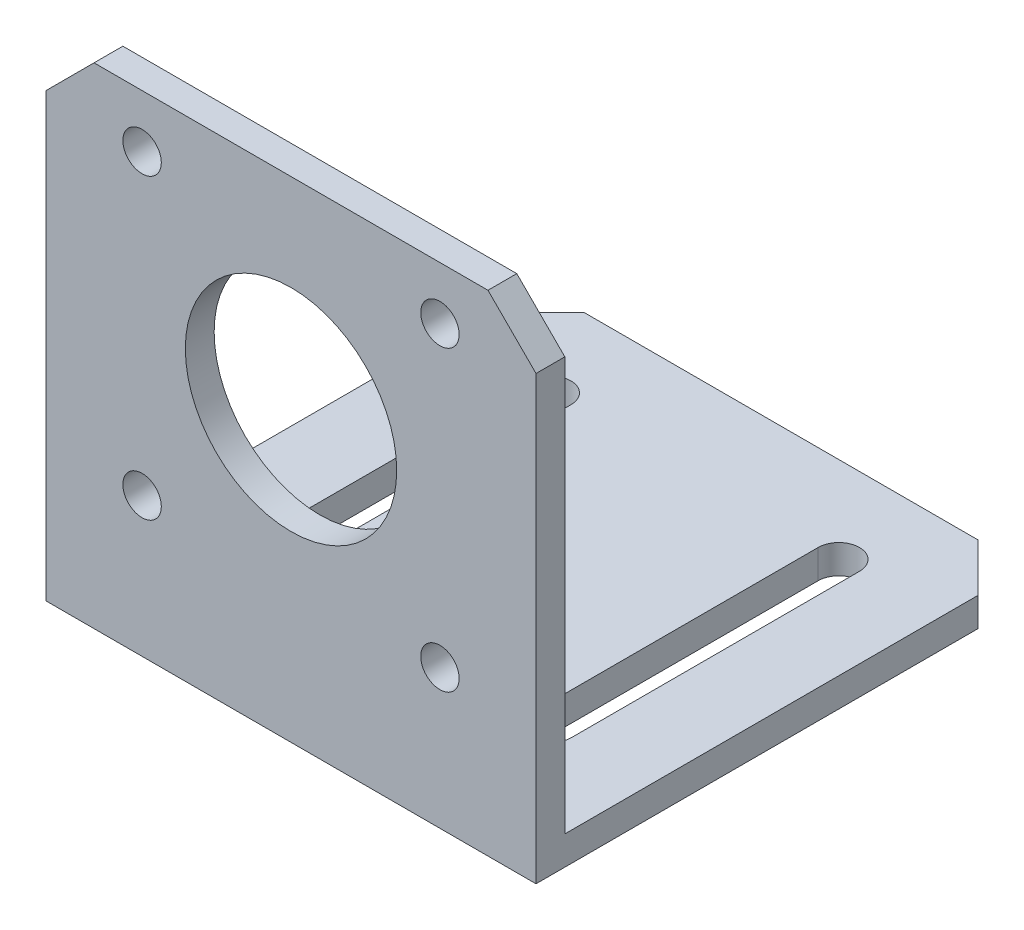
ISO-10303-21;
HEADER;
FILE_DESCRIPTION(('STEP AP214'),'2;1');
FILE_NAME('part.step','',(''),(''),'','','');
FILE_SCHEMA(('AUTOMOTIVE_DESIGN { 1 0 10303 214 1 1 1 1 }'));
ENDSEC;
DATA;
#1=APPLICATION_CONTEXT('core data for automotive mechanical design processes');
#2=APPLICATION_PROTOCOL_DEFINITION('international standard','automotive_design',2000,#1);
#3=PRODUCT_CONTEXT('',#1,'mechanical');
#4=PRODUCT('Part','Part','',(#3));
#5=PRODUCT_RELATED_PRODUCT_CATEGORY('part','',(#4));
#6=PRODUCT_DEFINITION_FORMATION('','',#4);
#7=PRODUCT_DEFINITION_CONTEXT('part definition',#1,'design');
#8=PRODUCT_DEFINITION('design','',#6,#7);
#9=PRODUCT_DEFINITION_SHAPE('','',#8);
#10=(LENGTH_UNIT() NAMED_UNIT(*) SI_UNIT(.MILLI.,.METRE.));
#11=(NAMED_UNIT(*) PLANE_ANGLE_UNIT() SI_UNIT($,.RADIAN.));
#12=(NAMED_UNIT(*) SI_UNIT($,.STERADIAN.) SOLID_ANGLE_UNIT());
#13=UNCERTAINTY_MEASURE_WITH_UNIT(LENGTH_MEASURE(1.E-05),#10,'distance_accuracy_value','');
#14=(GEOMETRIC_REPRESENTATION_CONTEXT(3) GLOBAL_UNCERTAINTY_ASSIGNED_CONTEXT((#13)) GLOBAL_UNIT_ASSIGNED_CONTEXT((#10,
#11,#12)) REPRESENTATION_CONTEXT('',''));
#15=CARTESIAN_POINT('',(0.,0.,0.));
#16=DIRECTION('',(0.,0.,1.));
#17=DIRECTION('',(1.,0.,0.));
#18=AXIS2_PLACEMENT_3D('',#15,#16,#17);
#19=CARTESIAN_POINT('',(-25.5,-25.5,51.));
#20=DIRECTION('',(1.,0.,0.));
#21=DIRECTION('',(0.,0.,-1.));
#22=AXIS2_PLACEMENT_3D('',#19,#20,#21);
#23=PLANE('',#22);
#24=DIRECTION('',(0.,0.,1.));
#25=VECTOR('',#24,1.);
#26=CARTESIAN_POINT('',(-25.5,-22.5,-6.2450360777744));
#27=LINE('',#26,#25);
#28=CARTESIAN_POINT('',(-25.5,-22.5,5.));
#29=VERTEX_POINT('',#28);
#30=CARTESIAN_POINT('',(-25.5,-22.5,48.));
#31=VERTEX_POINT('',#30);
#32=EDGE_CURVE('E228',#29,#31,#27,.T.);
#33=ORIENTED_EDGE('',*,*,#32,.F.);
#34=DIRECTION('',(0.,-1.,0.));
#35=VECTOR('',#34,1.);
#36=CARTESIAN_POINT('',(-25.5,-25.5,5.));
#37=LINE('',#36,#35);
#38=CARTESIAN_POINT('',(-25.5,-25.5,5.));
#39=VERTEX_POINT('',#38);
#40=EDGE_CURVE('E302',#29,#39,#37,.T.);
#41=ORIENTED_EDGE('',*,*,#40,.T.);
#42=DIRECTION('',(0.,0.,-1.));
#43=VECTOR('',#42,1.);
#44=CARTESIAN_POINT('',(-25.5,-25.5,51.));
#45=LINE('',#44,#43);
#46=CARTESIAN_POINT('',(-25.5,-25.5,51.));
#47=VERTEX_POINT('',#46);
#48=EDGE_CURVE('E253',#47,#39,#45,.T.);
#49=ORIENTED_EDGE('',*,*,#48,.F.);
#50=DIRECTION('',(0.,-1.,0.));
#51=VECTOR('',#50,1.);
#52=CARTESIAN_POINT('',(-25.5,-25.5,51.));
#53=LINE('',#52,#51);
#54=CARTESIAN_POINT('',(-25.5,20.5,51.));
#55=VERTEX_POINT('',#54);
#56=EDGE_CURVE('E239',#55,#47,#53,.T.);
#57=ORIENTED_EDGE('',*,*,#56,.F.);
#58=DIRECTION('',(0.,0.,-1.));
#59=VECTOR('',#58,1.);
#60=CARTESIAN_POINT('',(-25.5,20.5,51.));
#61=LINE('',#60,#59);
#62=CARTESIAN_POINT('',(-25.5,20.5,48.));
#63=VERTEX_POINT('',#62);
#64=EDGE_CURVE('E261',#55,#63,#61,.T.);
#65=ORIENTED_EDGE('',*,*,#64,.T.);
#66=DIRECTION('',(0.,1.,0.));
#67=VECTOR('',#66,1.);
#68=CARTESIAN_POINT('',(-25.5,30.9261573131927,48.));
#69=LINE('',#68,#67);
#70=EDGE_CURVE('E231',#31,#63,#69,.T.);
#71=ORIENTED_EDGE('',*,*,#70,.F.);
#72=EDGE_LOOP('',(#33,#41,#49,#57,#65,#71));
#73=FACE_BOUND('',#72,.T.);
#74=ADVANCED_FACE('F32',(#73),#23,.F.);
#75=CARTESIAN_POINT('',(25.5,-25.5,51.));
#76=DIRECTION('',(0.,1.,0.));
#77=DIRECTION('',(-1.,0.,0.));
#78=AXIS2_PLACEMENT_3D('',#75,#76,#77);
#79=PLANE('',#78);
#80=DIRECTION('',(0.,0.,-1.));
#81=VECTOR('',#80,1.);
#82=CARTESIAN_POINT('',(-17.165,-25.5,39.));
#83=LINE('',#82,#81);
#84=CARTESIAN_POINT('',(-17.165,-25.5,39.));
#85=VERTEX_POINT('',#84);
#86=CARTESIAN_POINT('',(-17.165,-25.5,9.));
#87=VERTEX_POINT('',#86);
#88=EDGE_CURVE('E174',#85,#87,#83,.T.);
#89=ORIENTED_EDGE('',*,*,#88,.F.);
#90=CARTESIAN_POINT('',(-15.015,-25.5,39.));
#91=DIRECTION('',(0.,-1.,0.));
#92=DIRECTION('',(1.,0.,0.));
#93=AXIS2_PLACEMENT_3D('',#90,#91,#92);
#94=CIRCLE('',#93,2.15000000000001);
#95=CARTESIAN_POINT('',(-12.865,-25.5,39.));
#96=VERTEX_POINT('',#95);
#97=EDGE_CURVE('E47',#96,#85,#94,.T.);
#98=ORIENTED_EDGE('',*,*,#97,.F.);
#99=DIRECTION('',(0.,0.,1.));
#100=VECTOR('',#99,1.);
#101=CARTESIAN_POINT('',(-12.865,-25.5,39.));
#102=LINE('',#101,#100);
#103=CARTESIAN_POINT('',(-12.865,-25.5,9.));
#104=VERTEX_POINT('',#103);
#105=EDGE_CURVE('E181',#104,#96,#102,.T.);
#106=ORIENTED_EDGE('',*,*,#105,.F.);
#107=CARTESIAN_POINT('',(-15.015,-25.5,9.));
#108=DIRECTION('',(0.,-1.,0.));
#109=DIRECTION('',(1.,0.,0.));
#110=AXIS2_PLACEMENT_3D('',#107,#108,#109);
#111=CIRCLE('',#110,2.14999999999999);
#112=EDGE_CURVE('E164',#87,#104,#111,.T.);
#113=ORIENTED_EDGE('',*,*,#112,.F.);
#114=EDGE_LOOP('',(#89,#98,#106,#113));
#115=FACE_BOUND('',#114,.T.);
#116=DIRECTION('',(0.,0.,-1.));
#117=VECTOR('',#116,1.);
#118=CARTESIAN_POINT('',(12.865,-25.5,39.));
#119=LINE('',#118,#117);
#120=CARTESIAN_POINT('',(12.865,-25.5,39.));
#121=VERTEX_POINT('',#120);
#122=CARTESIAN_POINT('',(12.865,-25.5,9.));
#123=VERTEX_POINT('',#122);
#124=EDGE_CURVE('E192',#121,#123,#119,.T.);
#125=ORIENTED_EDGE('',*,*,#124,.F.);
#126=CARTESIAN_POINT('',(15.015,-25.5,39.));
#127=DIRECTION('',(0.,-1.,0.));
#128=DIRECTION('',(-1.,0.,0.));
#129=AXIS2_PLACEMENT_3D('',#126,#127,#128);
#130=CIRCLE('',#129,2.15000000000001);
#131=CARTESIAN_POINT('',(17.165,-25.5,39.));
#132=VERTEX_POINT('',#131);
#133=EDGE_CURVE('E55',#132,#121,#130,.T.);
#134=ORIENTED_EDGE('',*,*,#133,.F.);
#135=DIRECTION('',(0.,0.,1.));
#136=VECTOR('',#135,1.);
#137=CARTESIAN_POINT('',(17.165,-25.5,39.));
#138=LINE('',#137,#136);
#139=CARTESIAN_POINT('',(17.165,-25.5,9.));
#140=VERTEX_POINT('',#139);
#141=EDGE_CURVE('E198',#140,#132,#138,.T.);
#142=ORIENTED_EDGE('',*,*,#141,.F.);
#143=CARTESIAN_POINT('',(15.015,-25.5,9.));
#144=DIRECTION('',(0.,-1.,0.));
#145=DIRECTION('',(-1.,0.,0.));
#146=AXIS2_PLACEMENT_3D('',#143,#144,#145);
#147=CIRCLE('',#146,2.14999999999999);
#148=EDGE_CURVE('E195',#123,#140,#147,.T.);
#149=ORIENTED_EDGE('',*,*,#148,.F.);
#150=EDGE_LOOP('',(#125,#134,#142,#149));
#151=FACE_BOUND('',#150,.T.);
#152=DIRECTION('',(1.,0.,0.));
#153=VECTOR('',#152,1.);
#154=CARTESIAN_POINT('',(25.5,-25.5,0.));
#155=LINE('',#154,#153);
#156=CARTESIAN_POINT('',(-20.5,-25.5,0.));
#157=VERTEX_POINT('',#156);
#158=CARTESIAN_POINT('',(20.5,-25.5,0.));
#159=VERTEX_POINT('',#158);
#160=EDGE_CURVE('E238',#157,#159,#155,.T.);
#161=ORIENTED_EDGE('',*,*,#160,.T.);
#162=DIRECTION('',(-0.707106781186549,0.,-0.707106781186546));
#163=VECTOR('',#162,1.);
#164=CARTESIAN_POINT('',(25.5,-25.5,5.));
#165=LINE('',#164,#163);
#166=CARTESIAN_POINT('',(25.5,-25.5,5.));
#167=VERTEX_POINT('',#166);
#168=EDGE_CURVE('E300',#159,#167,#165,.F.);
#169=ORIENTED_EDGE('',*,*,#168,.T.);
#170=DIRECTION('',(0.,0.,-1.));
#171=VECTOR('',#170,1.);
#172=CARTESIAN_POINT('',(25.5,-25.5,51.));
#173=LINE('',#172,#171);
#174=CARTESIAN_POINT('',(25.5,-25.5,51.));
#175=VERTEX_POINT('',#174);
#176=EDGE_CURVE('E248',#175,#167,#173,.T.);
#177=ORIENTED_EDGE('',*,*,#176,.F.);
#178=DIRECTION('',(1.,0.,0.));
#179=VECTOR('',#178,1.);
#180=CARTESIAN_POINT('',(25.5,-25.5,51.));
#181=LINE('',#180,#179);
#182=EDGE_CURVE('E241',#47,#175,#181,.T.);
#183=ORIENTED_EDGE('',*,*,#182,.F.);
#184=ORIENTED_EDGE('',*,*,#48,.T.);
#185=DIRECTION('',(-0.707106781186549,0.,0.707106781186546));
#186=VECTOR('',#185,1.);
#187=CARTESIAN_POINT('',(-25.5,-25.5,5.));
#188=LINE('',#187,#186);
#189=EDGE_CURVE('E298',#39,#157,#188,.F.);
#190=ORIENTED_EDGE('',*,*,#189,.T.);
#191=EDGE_LOOP('',(#161,#169,#177,#183,#184,#190));
#192=FACE_BOUND('',#191,.T.);
#193=ADVANCED_FACE('F178',(#115,#151,#192),#79,.F.);
#194=CARTESIAN_POINT('',(25.5,-25.5,51.));
#195=DIRECTION('',(-1.,0.,0.));
#196=DIRECTION('',(0.,0.,1.));
#197=AXIS2_PLACEMENT_3D('',#194,#195,#196);
#198=PLANE('',#197);
#199=ORIENTED_EDGE('',*,*,#176,.T.);
#200=DIRECTION('',(0.,1.,0.));
#201=VECTOR('',#200,1.);
#202=CARTESIAN_POINT('',(25.5,-25.5,5.));
#203=LINE('',#202,#201);
#204=CARTESIAN_POINT('',(25.5,-22.5,5.));
#205=VERTEX_POINT('',#204);
#206=EDGE_CURVE('E287',#167,#205,#203,.T.);
#207=ORIENTED_EDGE('',*,*,#206,.T.);
#208=DIRECTION('',(0.,0.,1.));
#209=VECTOR('',#208,1.);
#210=CARTESIAN_POINT('',(25.5,-22.5,-6.2450360777744));
#211=LINE('',#210,#209);
#212=CARTESIAN_POINT('',(25.5,-22.5,48.));
#213=VERTEX_POINT('',#212);
#214=EDGE_CURVE('E227',#205,#213,#211,.T.);
#215=ORIENTED_EDGE('',*,*,#214,.T.);
#216=DIRECTION('',(0.,1.,0.));
#217=VECTOR('',#216,1.);
#218=CARTESIAN_POINT('',(25.5,30.9261573131927,48.));
#219=LINE('',#218,#217);
#220=CARTESIAN_POINT('',(25.5,20.5,48.));
#221=VERTEX_POINT('',#220);
#222=EDGE_CURVE('E224',#213,#221,#219,.T.);
#223=ORIENTED_EDGE('',*,*,#222,.T.);
#224=DIRECTION('',(0.,0.,1.));
#225=VECTOR('',#224,1.);
#226=CARTESIAN_POINT('',(25.5,20.5,51.));
#227=LINE('',#226,#225);
#228=CARTESIAN_POINT('',(25.5,20.5,51.));
#229=VERTEX_POINT('',#228);
#230=EDGE_CURVE('E285',#221,#229,#227,.T.);
#231=ORIENTED_EDGE('',*,*,#230,.T.);
#232=DIRECTION('',(0.,1.,0.));
#233=VECTOR('',#232,1.);
#234=CARTESIAN_POINT('',(25.5,-25.5,51.));
#235=LINE('',#234,#233);
#236=EDGE_CURVE('E243',#175,#229,#235,.T.);
#237=ORIENTED_EDGE('',*,*,#236,.F.);
#238=EDGE_LOOP('',(#199,#207,#215,#223,#231,#237));
#239=FACE_BOUND('',#238,.T.);
#240=ADVANCED_FACE('F353',(#239),#198,.F.);
#241=CARTESIAN_POINT('',(25.5,25.5,51.));
#242=DIRECTION('',(0.,-1.,0.));
#243=DIRECTION('',(1.,0.,0.));
#244=AXIS2_PLACEMENT_3D('',#241,#242,#243);
#245=PLANE('',#244);
#246=DIRECTION('',(-1.,0.,0.));
#247=VECTOR('',#246,1.);
#248=CARTESIAN_POINT('',(25.5,25.5,51.));
#249=LINE('',#248,#247);
#250=CARTESIAN_POINT('',(20.5,25.5,51.));
#251=VERTEX_POINT('',#250);
#252=CARTESIAN_POINT('',(-20.5,25.5,51.));
#253=VERTEX_POINT('',#252);
#254=EDGE_CURVE('E246',#251,#253,#249,.T.);
#255=ORIENTED_EDGE('',*,*,#254,.F.);
#256=DIRECTION('',(0.,0.,-1.));
#257=VECTOR('',#256,1.);
#258=CARTESIAN_POINT('',(20.5,25.5,51.));
#259=LINE('',#258,#257);
#260=CARTESIAN_POINT('',(20.5,25.5,48.));
#261=VERTEX_POINT('',#260);
#262=EDGE_CURVE('E305',#251,#261,#259,.T.);
#263=ORIENTED_EDGE('',*,*,#262,.T.);
#264=DIRECTION('',(-1.,0.,0.));
#265=VECTOR('',#264,1.);
#266=CARTESIAN_POINT('',(25.5,25.5,48.));
#267=LINE('',#266,#265);
#268=CARTESIAN_POINT('',(-20.5,25.5,48.));
#269=VERTEX_POINT('',#268);
#270=EDGE_CURVE('E259',#261,#269,#267,.T.);
#271=ORIENTED_EDGE('',*,*,#270,.T.);
#272=DIRECTION('',(0.,0.,1.));
#273=VECTOR('',#272,1.);
#274=CARTESIAN_POINT('',(-20.5,25.5,51.));
#275=LINE('',#274,#273);
#276=EDGE_CURVE('E280',#269,#253,#275,.T.);
#277=ORIENTED_EDGE('',*,*,#276,.T.);
#278=EDGE_LOOP('',(#255,#263,#271,#277));
#279=FACE_BOUND('',#278,.T.);
#280=ADVANCED_FACE('F406',(#279),#245,.F.);
#281=CARTESIAN_POINT('',(0.,0.,51.));
#282=DIRECTION('',(0.,0.,1.));
#283=DIRECTION('',(1.,0.,0.));
#284=AXIS2_PLACEMENT_3D('',#281,#282,#283);
#285=PLANE('',#284);
#286=CARTESIAN_POINT('',(15.5,-11.,51.));
#287=DIRECTION('',(0.,0.,1.));
#288=DIRECTION('',(1.,0.,0.));
#289=AXIS2_PLACEMENT_3D('',#286,#287,#288);
#290=CIRCLE('',#289,2.);
#291=CARTESIAN_POINT('',(17.5,-11.,51.));
#292=VERTEX_POINT('',#291);
#293=EDGE_CURVE('E188',#292,#292,#290,.T.);
#294=ORIENTED_EDGE('',*,*,#293,.F.);
#295=EDGE_LOOP('',(#294));
#296=FACE_BOUND('',#295,.T.);
#297=CARTESIAN_POINT('',(-15.5,-11.,51.));
#298=DIRECTION('',(0.,0.,1.));
#299=DIRECTION('',(1.,0.,0.));
#300=AXIS2_PLACEMENT_3D('',#297,#298,#299);
#301=CIRCLE('',#300,2.);
#302=CARTESIAN_POINT('',(-13.5,-11.,51.));
#303=VERTEX_POINT('',#302);
#304=EDGE_CURVE('E216',#303,#303,#301,.T.);
#305=ORIENTED_EDGE('',*,*,#304,.F.);
#306=EDGE_LOOP('',(#305));
#307=FACE_BOUND('',#306,.T.);
#308=CARTESIAN_POINT('',(15.5,20.,51.));
#309=DIRECTION('',(0.,0.,1.));
#310=DIRECTION('',(1.,0.,0.));
#311=AXIS2_PLACEMENT_3D('',#308,#309,#310);
#312=CIRCLE('',#311,2.);
#313=CARTESIAN_POINT('',(17.5,20.,51.));
#314=VERTEX_POINT('',#313);
#315=EDGE_CURVE('E213',#314,#314,#312,.T.);
#316=ORIENTED_EDGE('',*,*,#315,.F.);
#317=EDGE_LOOP('',(#316));
#318=FACE_BOUND('',#317,.T.);
#319=CARTESIAN_POINT('',(-15.5,20.,51.));
#320=DIRECTION('',(0.,0.,1.));
#321=DIRECTION('',(1.,0.,0.));
#322=AXIS2_PLACEMENT_3D('',#319,#320,#321);
#323=CIRCLE('',#322,2.);
#324=CARTESIAN_POINT('',(-13.5,20.,51.));
#325=VERTEX_POINT('',#324);
#326=EDGE_CURVE('E209',#325,#325,#323,.T.);
#327=ORIENTED_EDGE('',*,*,#326,.F.);
#328=EDGE_LOOP('',(#327));
#329=FACE_BOUND('',#328,.T.);
#330=CARTESIAN_POINT('',(0.,4.50000000000001,51.));
#331=DIRECTION('',(0.,0.,1.));
#332=DIRECTION('',(1.,0.,0.));
#333=AXIS2_PLACEMENT_3D('',#330,#331,#332);
#334=CIRCLE('',#333,11.);
#335=CARTESIAN_POINT('',(11.,4.50000000000001,51.));
#336=VERTEX_POINT('',#335);
#337=EDGE_CURVE('E212',#336,#336,#334,.T.);
#338=ORIENTED_EDGE('',*,*,#337,.F.);
#339=EDGE_LOOP('',(#338));
#340=FACE_BOUND('',#339,.T.);
#341=ORIENTED_EDGE('',*,*,#236,.T.);
#342=DIRECTION('',(0.707106781186546,-0.707106781186549,0.));
#343=VECTOR('',#342,1.);
#344=CARTESIAN_POINT('',(23.0000000000001,22.9999999999999,51.));
#345=LINE('',#344,#343);
#346=EDGE_CURVE('E310',#229,#251,#345,.F.);
#347=ORIENTED_EDGE('',*,*,#346,.T.);
#348=ORIENTED_EDGE('',*,*,#254,.T.);
#349=DIRECTION('',(0.707106781186549,0.707106781186546,0.));
#350=VECTOR('',#349,1.);
#351=CARTESIAN_POINT('',(-22.9999999999999,23.0000000000001,51.));
#352=LINE('',#351,#350);
#353=EDGE_CURVE('E283',#253,#55,#352,.F.);
#354=ORIENTED_EDGE('',*,*,#353,.T.);
#355=ORIENTED_EDGE('',*,*,#56,.T.);
#356=ORIENTED_EDGE('',*,*,#182,.T.);
#357=EDGE_LOOP('',(#341,#347,#348,#354,#355,#356));
#358=FACE_BOUND('',#357,.T.);
#359=ADVANCED_FACE('F409',(#296,#307,#318,#329,#340,#358),#285,.T.);
#360=CARTESIAN_POINT('',(0.,0.,0.));
#361=DIRECTION('',(0.,0.,1.));
#362=DIRECTION('',(1.,0.,0.));
#363=AXIS2_PLACEMENT_3D('',#360,#361,#362);
#364=PLANE('',#363);
#365=DIRECTION('',(1.,0.,0.));
#366=VECTOR('',#365,1.);
#367=CARTESIAN_POINT('',(0.,-22.5,0.));
#368=LINE('',#367,#366);
#369=CARTESIAN_POINT('',(-20.5,-22.5,0.));
#370=VERTEX_POINT('',#369);
#371=CARTESIAN_POINT('',(20.5,-22.5,0.));
#372=VERTEX_POINT('',#371);
#373=EDGE_CURVE('E256',#370,#372,#368,.T.);
#374=ORIENTED_EDGE('',*,*,#373,.T.);
#375=DIRECTION('',(0.,-1.,0.));
#376=VECTOR('',#375,1.);
#377=CARTESIAN_POINT('',(20.5,0.,0.));
#378=LINE('',#377,#376);
#379=EDGE_CURVE('E296',#372,#159,#378,.T.);
#380=ORIENTED_EDGE('',*,*,#379,.T.);
#381=ORIENTED_EDGE('',*,*,#160,.F.);
#382=DIRECTION('',(0.,1.,0.));
#383=VECTOR('',#382,1.);
#384=CARTESIAN_POINT('',(-20.5,0.,0.));
#385=LINE('',#384,#383);
#386=EDGE_CURVE('E294',#157,#370,#385,.T.);
#387=ORIENTED_EDGE('',*,*,#386,.T.);
#388=EDGE_LOOP('',(#374,#380,#381,#387));
#389=FACE_BOUND('',#388,.T.);
#390=ADVANCED_FACE('F399',(#389),#364,.F.);
#391=CARTESIAN_POINT('',(25.5,30.9261573131927,48.));
#392=DIRECTION('',(0.,0.,1.));
#393=DIRECTION('',(0.,-1.,0.));
#394=AXIS2_PLACEMENT_3D('',#391,#392,#393);
#395=PLANE('',#394);
#396=CARTESIAN_POINT('',(15.5,-11.,48.));
#397=DIRECTION('',(0.,0.,1.));
#398=DIRECTION('',(0.,-1.,0.));
#399=AXIS2_PLACEMENT_3D('',#396,#397,#398);
#400=CIRCLE('',#399,2.);
#401=CARTESIAN_POINT('',(15.5,-13.,48.));
#402=VERTEX_POINT('',#401);
#403=EDGE_CURVE('E234',#402,#402,#400,.T.);
#404=ORIENTED_EDGE('',*,*,#403,.T.);
#405=EDGE_LOOP('',(#404));
#406=FACE_BOUND('',#405,.T.);
#407=CARTESIAN_POINT('',(-15.5,-11.,48.));
#408=DIRECTION('',(0.,0.,1.));
#409=DIRECTION('',(0.,-1.,0.));
#410=AXIS2_PLACEMENT_3D('',#407,#408,#409);
#411=CIRCLE('',#410,2.);
#412=CARTESIAN_POINT('',(-15.5,-13.,48.));
#413=VERTEX_POINT('',#412);
#414=EDGE_CURVE('E270',#413,#413,#411,.T.);
#415=ORIENTED_EDGE('',*,*,#414,.T.);
#416=EDGE_LOOP('',(#415));
#417=FACE_BOUND('',#416,.T.);
#418=CARTESIAN_POINT('',(15.5,20.,48.));
#419=DIRECTION('',(0.,0.,1.));
#420=DIRECTION('',(0.,-1.,0.));
#421=AXIS2_PLACEMENT_3D('',#418,#419,#420);
#422=CIRCLE('',#421,2.);
#423=CARTESIAN_POINT('',(15.5,18.,48.));
#424=VERTEX_POINT('',#423);
#425=EDGE_CURVE('E267',#424,#424,#422,.T.);
#426=ORIENTED_EDGE('',*,*,#425,.T.);
#427=EDGE_LOOP('',(#426));
#428=FACE_BOUND('',#427,.T.);
#429=CARTESIAN_POINT('',(-15.5,20.,48.));
#430=DIRECTION('',(0.,0.,1.));
#431=DIRECTION('',(0.,-1.,0.));
#432=AXIS2_PLACEMENT_3D('',#429,#430,#431);
#433=CIRCLE('',#432,2.);
#434=CARTESIAN_POINT('',(-15.5,18.,48.));
#435=VERTEX_POINT('',#434);
#436=EDGE_CURVE('E264',#435,#435,#433,.T.);
#437=ORIENTED_EDGE('',*,*,#436,.T.);
#438=EDGE_LOOP('',(#437));
#439=FACE_BOUND('',#438,.T.);
#440=CARTESIAN_POINT('',(0.,4.50000000000001,48.));
#441=DIRECTION('',(0.,0.,1.));
#442=DIRECTION('',(0.,-1.,0.));
#443=AXIS2_PLACEMENT_3D('',#440,#441,#442);
#444=CIRCLE('',#443,11.);
#445=CARTESIAN_POINT('',(0.,-6.49999999999999,48.));
#446=VERTEX_POINT('',#445);
#447=EDGE_CURVE('E223',#446,#446,#444,.T.);
#448=ORIENTED_EDGE('',*,*,#447,.T.);
#449=EDGE_LOOP('',(#448));
#450=FACE_BOUND('',#449,.T.);
#451=ORIENTED_EDGE('',*,*,#270,.F.);
#452=DIRECTION('',(-0.707106781186546,0.707106781186549,0.));
#453=VECTOR('',#452,1.);
#454=CARTESIAN_POINT('',(20.5,25.5,48.));
#455=LINE('',#454,#453);
#456=EDGE_CURVE('E308',#261,#221,#455,.F.);
#457=ORIENTED_EDGE('',*,*,#456,.T.);
#458=ORIENTED_EDGE('',*,*,#222,.F.);
#459=DIRECTION('',(-1.,0.,0.));
#460=VECTOR('',#459,1.);
#461=CARTESIAN_POINT('',(25.5,-22.5,48.));
#462=LINE('',#461,#460);
#463=EDGE_CURVE('E230',#213,#31,#462,.T.);
#464=ORIENTED_EDGE('',*,*,#463,.T.);
#465=ORIENTED_EDGE('',*,*,#70,.T.);
#466=DIRECTION('',(-0.707106781186549,-0.707106781186546,0.));
#467=VECTOR('',#466,1.);
#468=CARTESIAN_POINT('',(-25.5,20.5,48.));
#469=LINE('',#468,#467);
#470=EDGE_CURVE('E277',#63,#269,#469,.F.);
#471=ORIENTED_EDGE('',*,*,#470,.T.);
#472=EDGE_LOOP('',(#451,#457,#458,#464,#465,#471));
#473=FACE_BOUND('',#472,.T.);
#474=ADVANCED_FACE('F387',(#406,#417,#428,#439,#450,#473),#395,.F.);
#475=CARTESIAN_POINT('',(25.5,-22.5,-6.2450360777744));
#476=DIRECTION('',(0.,-1.,0.));
#477=DIRECTION('',(0.,0.,-1.));
#478=AXIS2_PLACEMENT_3D('',#475,#476,#477);
#479=PLANE('',#478);
#480=DIRECTION('',(0.,0.,1.));
#481=VECTOR('',#480,1.);
#482=CARTESIAN_POINT('',(-12.865,-22.5,-6.24503607777439));
#483=LINE('',#482,#481);
#484=CARTESIAN_POINT('',(-12.865,-22.5,9.));
#485=VERTEX_POINT('',#484);
#486=CARTESIAN_POINT('',(-12.865,-22.5,39.));
#487=VERTEX_POINT('',#486);
#488=EDGE_CURVE('E40',#485,#487,#483,.T.);
#489=ORIENTED_EDGE('',*,*,#488,.T.);
#490=CARTESIAN_POINT('',(-15.015,-22.5,39.));
#491=DIRECTION('',(0.,-1.,0.));
#492=DIRECTION('',(0.,0.,-1.));
#493=AXIS2_PLACEMENT_3D('',#490,#491,#492);
#494=CIRCLE('',#493,2.15000000000001);
#495=CARTESIAN_POINT('',(-17.165,-22.5,39.));
#496=VERTEX_POINT('',#495);
#497=EDGE_CURVE('E11',#487,#496,#494,.T.);
#498=ORIENTED_EDGE('',*,*,#497,.T.);
#499=DIRECTION('',(0.,0.,-1.));
#500=VECTOR('',#499,1.);
#501=CARTESIAN_POINT('',(-17.165,-22.5,-6.24503607777443));
#502=LINE('',#501,#500);
#503=CARTESIAN_POINT('',(-17.165,-22.5,9.));
#504=VERTEX_POINT('',#503);
#505=EDGE_CURVE('E324',#496,#504,#502,.T.);
#506=ORIENTED_EDGE('',*,*,#505,.T.);
#507=CARTESIAN_POINT('',(-15.015,-22.5,9.));
#508=DIRECTION('',(0.,-1.,0.));
#509=DIRECTION('',(0.,0.,-1.));
#510=AXIS2_PLACEMENT_3D('',#507,#508,#509);
#511=CIRCLE('',#510,2.14999999999999);
#512=EDGE_CURVE('E167',#504,#485,#511,.T.);
#513=ORIENTED_EDGE('',*,*,#512,.T.);
#514=EDGE_LOOP('',(#489,#498,#506,#513));
#515=FACE_BOUND('',#514,.T.);
#516=DIRECTION('',(0.,0.,1.));
#517=VECTOR('',#516,1.);
#518=CARTESIAN_POINT('',(17.165,-22.5,-6.2450360777744));
#519=LINE('',#518,#517);
#520=CARTESIAN_POINT('',(17.165,-22.5,9.));
#521=VERTEX_POINT('',#520);
#522=CARTESIAN_POINT('',(17.165,-22.5,39.));
#523=VERTEX_POINT('',#522);
#524=EDGE_CURVE('E318',#521,#523,#519,.T.);
#525=ORIENTED_EDGE('',*,*,#524,.T.);
#526=CARTESIAN_POINT('',(15.015,-22.5,39.));
#527=DIRECTION('',(0.,-1.,0.));
#528=DIRECTION('',(0.,0.,-1.));
#529=AXIS2_PLACEMENT_3D('',#526,#527,#528);
#530=CIRCLE('',#529,2.15000000000001);
#531=CARTESIAN_POINT('',(12.865,-22.5,39.));
#532=VERTEX_POINT('',#531);
#533=EDGE_CURVE('E321',#523,#532,#530,.T.);
#534=ORIENTED_EDGE('',*,*,#533,.T.);
#535=DIRECTION('',(0.,0.,-1.));
#536=VECTOR('',#535,1.);
#537=CARTESIAN_POINT('',(12.865,-22.5,-6.24503607777441));
#538=LINE('',#537,#536);
#539=CARTESIAN_POINT('',(12.865,-22.5,9.));
#540=VERTEX_POINT('',#539);
#541=EDGE_CURVE('E312',#532,#540,#538,.T.);
#542=ORIENTED_EDGE('',*,*,#541,.T.);
#543=CARTESIAN_POINT('',(15.015,-22.5,9.));
#544=DIRECTION('',(0.,-1.,0.));
#545=DIRECTION('',(0.,0.,-1.));
#546=AXIS2_PLACEMENT_3D('',#543,#544,#545);
#547=CIRCLE('',#546,2.14999999999999);
#548=EDGE_CURVE('E315',#540,#521,#547,.T.);
#549=ORIENTED_EDGE('',*,*,#548,.T.);
#550=EDGE_LOOP('',(#525,#534,#542,#549));
#551=FACE_BOUND('',#550,.T.);
#552=ORIENTED_EDGE('',*,*,#214,.F.);
#553=DIRECTION('',(0.707106781186549,0.,0.707106781186546));
#554=VECTOR('',#553,1.);
#555=CARTESIAN_POINT('',(25.5,-22.5,5.));
#556=LINE('',#555,#554);
#557=EDGE_CURVE('E292',#205,#372,#556,.F.);
#558=ORIENTED_EDGE('',*,*,#557,.T.);
#559=ORIENTED_EDGE('',*,*,#373,.F.);
#560=DIRECTION('',(0.707106781186549,0.,-0.707106781186546));
#561=VECTOR('',#560,1.);
#562=CARTESIAN_POINT('',(-25.5,-22.5,5.));
#563=LINE('',#562,#561);
#564=EDGE_CURVE('E290',#370,#29,#563,.F.);
#565=ORIENTED_EDGE('',*,*,#564,.T.);
#566=ORIENTED_EDGE('',*,*,#32,.T.);
#567=ORIENTED_EDGE('',*,*,#463,.F.);
#568=EDGE_LOOP('',(#552,#558,#559,#565,#566,#567));
#569=FACE_BOUND('',#568,.T.);
#570=ADVANCED_FACE('F328',(#515,#551,#569),#479,.F.);
#571=CARTESIAN_POINT('',(0.,4.50000000000001,0.));
#572=DIRECTION('',(0.,0.,1.));
#573=DIRECTION('',(1.,0.,0.));
#574=AXIS2_PLACEMENT_3D('',#571,#572,#573);
#575=CYLINDRICAL_SURFACE('',#574,11.);
#576=ORIENTED_EDGE('',*,*,#337,.T.);
#577=EDGE_LOOP('',(#576));
#578=FACE_BOUND('',#577,.T.);
#579=ORIENTED_EDGE('',*,*,#447,.F.);
#580=EDGE_LOOP('',(#579));
#581=FACE_BOUND('',#580,.T.);
#582=ADVANCED_FACE('F483',(#578,#581),#575,.F.);
#583=CARTESIAN_POINT('',(-15.5,20.,0.));
#584=DIRECTION('',(0.,0.,1.));
#585=DIRECTION('',(1.,0.,0.));
#586=AXIS2_PLACEMENT_3D('',#583,#584,#585);
#587=CYLINDRICAL_SURFACE('',#586,2.);
#588=ORIENTED_EDGE('',*,*,#326,.T.);
#589=EDGE_LOOP('',(#588));
#590=FACE_BOUND('',#589,.T.);
#591=ORIENTED_EDGE('',*,*,#436,.F.);
#592=EDGE_LOOP('',(#591));
#593=FACE_BOUND('',#592,.T.);
#594=ADVANCED_FACE('F544',(#590,#593),#587,.F.);
#595=CARTESIAN_POINT('',(15.5,20.,0.));
#596=DIRECTION('',(0.,0.,1.));
#597=DIRECTION('',(1.,0.,0.));
#598=AXIS2_PLACEMENT_3D('',#595,#596,#597);
#599=CYLINDRICAL_SURFACE('',#598,2.);
#600=ORIENTED_EDGE('',*,*,#315,.T.);
#601=EDGE_LOOP('',(#600));
#602=FACE_BOUND('',#601,.T.);
#603=ORIENTED_EDGE('',*,*,#425,.F.);
#604=EDGE_LOOP('',(#603));
#605=FACE_BOUND('',#604,.T.);
#606=ADVANCED_FACE('F547',(#602,#605),#599,.F.);
#607=CARTESIAN_POINT('',(-15.5,-11.,0.));
#608=DIRECTION('',(0.,0.,1.));
#609=DIRECTION('',(1.,0.,0.));
#610=AXIS2_PLACEMENT_3D('',#607,#608,#609);
#611=CYLINDRICAL_SURFACE('',#610,2.);
#612=ORIENTED_EDGE('',*,*,#304,.T.);
#613=EDGE_LOOP('',(#612));
#614=FACE_BOUND('',#613,.T.);
#615=ORIENTED_EDGE('',*,*,#414,.F.);
#616=EDGE_LOOP('',(#615));
#617=FACE_BOUND('',#616,.T.);
#618=ADVANCED_FACE('F551',(#614,#617),#611,.F.);
#619=CARTESIAN_POINT('',(15.5,-11.,0.));
#620=DIRECTION('',(0.,0.,1.));
#621=DIRECTION('',(1.,0.,0.));
#622=AXIS2_PLACEMENT_3D('',#619,#620,#621);
#623=CYLINDRICAL_SURFACE('',#622,2.);
#624=ORIENTED_EDGE('',*,*,#293,.T.);
#625=EDGE_LOOP('',(#624));
#626=FACE_BOUND('',#625,.T.);
#627=ORIENTED_EDGE('',*,*,#403,.F.);
#628=EDGE_LOOP('',(#627));
#629=FACE_BOUND('',#628,.T.);
#630=ADVANCED_FACE('F362',(#626,#629),#623,.F.);
#631=CARTESIAN_POINT('',(-25.5,20.5,51.));
#632=DIRECTION('',(0.707106781186546,-0.707106781186549,0.));
#633=DIRECTION('',(0.,0.,-1.));
#634=AXIS2_PLACEMENT_3D('',#631,#632,#633);
#635=PLANE('',#634);
#636=ORIENTED_EDGE('',*,*,#353,.F.);
#637=ORIENTED_EDGE('',*,*,#276,.F.);
#638=ORIENTED_EDGE('',*,*,#470,.F.);
#639=ORIENTED_EDGE('',*,*,#64,.F.);
#640=EDGE_LOOP('',(#636,#637,#638,#639));
#641=FACE_BOUND('',#640,.T.);
#642=ADVANCED_FACE('F358',(#641),#635,.F.);
#643=CARTESIAN_POINT('',(25.5,-25.5,5.));
#644=DIRECTION('',(-0.707106781186546,0.,0.707106781186549));
#645=DIRECTION('',(0.,1.,0.));
#646=AXIS2_PLACEMENT_3D('',#643,#644,#645);
#647=PLANE('',#646);
#648=ORIENTED_EDGE('',*,*,#168,.F.);
#649=ORIENTED_EDGE('',*,*,#379,.F.);
#650=ORIENTED_EDGE('',*,*,#557,.F.);
#651=ORIENTED_EDGE('',*,*,#206,.F.);
#652=EDGE_LOOP('',(#648,#649,#650,#651));
#653=FACE_BOUND('',#652,.T.);
#654=ADVANCED_FACE('F361',(#653),#647,.F.);
#655=CARTESIAN_POINT('',(-25.5,-25.5,5.));
#656=DIRECTION('',(0.707106781186546,0.,0.707106781186549));
#657=DIRECTION('',(0.,-1.,0.));
#658=AXIS2_PLACEMENT_3D('',#655,#656,#657);
#659=PLANE('',#658);
#660=ORIENTED_EDGE('',*,*,#564,.F.);
#661=ORIENTED_EDGE('',*,*,#386,.F.);
#662=ORIENTED_EDGE('',*,*,#189,.F.);
#663=ORIENTED_EDGE('',*,*,#40,.F.);
#664=EDGE_LOOP('',(#660,#661,#662,#663));
#665=FACE_BOUND('',#664,.T.);
#666=ADVANCED_FACE('F365',(#665),#659,.F.);
#667=CARTESIAN_POINT('',(20.5,25.5,51.));
#668=DIRECTION('',(-0.707106781186549,-0.707106781186546,0.));
#669=DIRECTION('',(0.,0.,-1.));
#670=AXIS2_PLACEMENT_3D('',#667,#668,#669);
#671=PLANE('',#670);
#672=ORIENTED_EDGE('',*,*,#346,.F.);
#673=ORIENTED_EDGE('',*,*,#230,.F.);
#674=ORIENTED_EDGE('',*,*,#456,.F.);
#675=ORIENTED_EDGE('',*,*,#262,.F.);
#676=EDGE_LOOP('',(#672,#673,#674,#675));
#677=FACE_BOUND('',#676,.T.);
#678=ADVANCED_FACE('F34',(#677),#671,.F.);
#679=CARTESIAN_POINT('',(15.015,25.5,39.));
#680=DIRECTION('',(0.,-1.,0.));
#681=DIRECTION('',(1.,0.,0.));
#682=AXIS2_PLACEMENT_3D('',#679,#680,#681);
#683=CYLINDRICAL_SURFACE('',#682,2.15000000000001);
#684=DIRECTION('',(0.,-1.,0.));
#685=VECTOR('',#684,1.);
#686=CARTESIAN_POINT('',(17.165,25.5,39.));
#687=LINE('',#686,#685);
#688=EDGE_CURVE('E202',#523,#132,#687,.T.);
#689=ORIENTED_EDGE('',*,*,#688,.T.);
#690=ORIENTED_EDGE('',*,*,#133,.T.);
#691=DIRECTION('',(0.,-1.,0.));
#692=VECTOR('',#691,1.);
#693=CARTESIAN_POINT('',(12.865,25.5,39.));
#694=LINE('',#693,#692);
#695=EDGE_CURVE('E201',#532,#121,#694,.T.);
#696=ORIENTED_EDGE('',*,*,#695,.F.);
#697=ORIENTED_EDGE('',*,*,#533,.F.);
#698=EDGE_LOOP('',(#689,#690,#696,#697));
#699=FACE_BOUND('',#698,.T.);
#700=ADVANCED_FACE('F372',(#699),#683,.F.);
#701=CARTESIAN_POINT('',(17.165,25.5,39.));
#702=DIRECTION('',(1.,0.,0.));
#703=DIRECTION('',(0.,0.,-1.));
#704=AXIS2_PLACEMENT_3D('',#701,#702,#703);
#705=PLANE('',#704);
#706=DIRECTION('',(0.,-1.,0.));
#707=VECTOR('',#706,1.);
#708=CARTESIAN_POINT('',(17.165,25.5,9.));
#709=LINE('',#708,#707);
#710=EDGE_CURVE('E204',#521,#140,#709,.T.);
#711=ORIENTED_EDGE('',*,*,#710,.T.);
#712=ORIENTED_EDGE('',*,*,#141,.T.);
#713=ORIENTED_EDGE('',*,*,#688,.F.);
#714=ORIENTED_EDGE('',*,*,#524,.F.);
#715=EDGE_LOOP('',(#711,#712,#713,#714));
#716=FACE_BOUND('',#715,.T.);
#717=ADVANCED_FACE('F491',(#716),#705,.F.);
#718=CARTESIAN_POINT('',(15.015,25.5,9.));
#719=DIRECTION('',(0.,-1.,0.));
#720=DIRECTION('',(1.,0.,0.));
#721=AXIS2_PLACEMENT_3D('',#718,#719,#720);
#722=CYLINDRICAL_SURFACE('',#721,2.14999999999999);
#723=DIRECTION('',(0.,-1.,0.));
#724=VECTOR('',#723,1.);
#725=CARTESIAN_POINT('',(12.865,25.5,9.));
#726=LINE('',#725,#724);
#727=EDGE_CURVE('E206',#540,#123,#726,.T.);
#728=ORIENTED_EDGE('',*,*,#727,.T.);
#729=ORIENTED_EDGE('',*,*,#148,.T.);
#730=ORIENTED_EDGE('',*,*,#710,.F.);
#731=ORIENTED_EDGE('',*,*,#548,.F.);
#732=EDGE_LOOP('',(#728,#729,#730,#731));
#733=FACE_BOUND('',#732,.T.);
#734=ADVANCED_FACE('F342',(#733),#722,.F.);
#735=CARTESIAN_POINT('',(12.865,25.5,39.));
#736=DIRECTION('',(-1.,0.,0.));
#737=DIRECTION('',(0.,0.,1.));
#738=AXIS2_PLACEMENT_3D('',#735,#736,#737);
#739=PLANE('',#738);
#740=ORIENTED_EDGE('',*,*,#695,.T.);
#741=ORIENTED_EDGE('',*,*,#124,.T.);
#742=ORIENTED_EDGE('',*,*,#727,.F.);
#743=ORIENTED_EDGE('',*,*,#541,.F.);
#744=EDGE_LOOP('',(#740,#741,#742,#743));
#745=FACE_BOUND('',#744,.T.);
#746=ADVANCED_FACE('F335',(#745),#739,.F.);
#747=CARTESIAN_POINT('',(-15.015,25.5,39.));
#748=DIRECTION('',(0.,-1.,0.));
#749=DIRECTION('',(1.,0.,0.));
#750=AXIS2_PLACEMENT_3D('',#747,#748,#749);
#751=CYLINDRICAL_SURFACE('',#750,2.15000000000001);
#752=DIRECTION('',(0.,-1.,0.));
#753=VECTOR('',#752,1.);
#754=CARTESIAN_POINT('',(-12.865,25.5,39.));
#755=LINE('',#754,#753);
#756=EDGE_CURVE('E186',#487,#96,#755,.T.);
#757=ORIENTED_EDGE('',*,*,#756,.T.);
#758=ORIENTED_EDGE('',*,*,#97,.T.);
#759=DIRECTION('',(0.,-1.,0.));
#760=VECTOR('',#759,1.);
#761=CARTESIAN_POINT('',(-17.165,25.5,39.));
#762=LINE('',#761,#760);
#763=EDGE_CURVE('E171',#496,#85,#762,.T.);
#764=ORIENTED_EDGE('',*,*,#763,.F.);
#765=ORIENTED_EDGE('',*,*,#497,.F.);
#766=EDGE_LOOP('',(#757,#758,#764,#765));
#767=FACE_BOUND('',#766,.T.);
#768=ADVANCED_FACE('F333',(#767),#751,.F.);
#769=CARTESIAN_POINT('',(-12.865,25.5,39.));
#770=DIRECTION('',(1.,0.,0.));
#771=DIRECTION('',(0.,0.,-1.));
#772=AXIS2_PLACEMENT_3D('',#769,#770,#771);
#773=PLANE('',#772);
#774=DIRECTION('',(0.,-1.,0.));
#775=VECTOR('',#774,1.);
#776=CARTESIAN_POINT('',(-12.865,25.5,9.));
#777=LINE('',#776,#775);
#778=EDGE_CURVE('E170',#485,#104,#777,.T.);
#779=ORIENTED_EDGE('',*,*,#778,.T.);
#780=ORIENTED_EDGE('',*,*,#105,.T.);
#781=ORIENTED_EDGE('',*,*,#756,.F.);
#782=ORIENTED_EDGE('',*,*,#488,.F.);
#783=EDGE_LOOP('',(#779,#780,#781,#782));
#784=FACE_BOUND('',#783,.T.);
#785=ADVANCED_FACE('F332',(#784),#773,.F.);
#786=CARTESIAN_POINT('',(-15.015,25.5,9.));
#787=DIRECTION('',(0.,-1.,0.));
#788=DIRECTION('',(1.,0.,0.));
#789=AXIS2_PLACEMENT_3D('',#786,#787,#788);
#790=CYLINDRICAL_SURFACE('',#789,2.14999999999999);
#791=DIRECTION('',(0.,-1.,0.));
#792=VECTOR('',#791,1.);
#793=CARTESIAN_POINT('',(-17.165,25.5,9.));
#794=LINE('',#793,#792);
#795=EDGE_CURVE('E159',#504,#87,#794,.T.);
#796=ORIENTED_EDGE('',*,*,#795,.T.);
#797=ORIENTED_EDGE('',*,*,#112,.T.);
#798=ORIENTED_EDGE('',*,*,#778,.F.);
#799=ORIENTED_EDGE('',*,*,#512,.F.);
#800=EDGE_LOOP('',(#796,#797,#798,#799));
#801=FACE_BOUND('',#800,.T.);
#802=ADVANCED_FACE('F161',(#801),#790,.F.);
#803=CARTESIAN_POINT('',(-17.165,25.5,39.));
#804=DIRECTION('',(-1.,0.,0.));
#805=DIRECTION('',(0.,0.,1.));
#806=AXIS2_PLACEMENT_3D('',#803,#804,#805);
#807=PLANE('',#806);
#808=ORIENTED_EDGE('',*,*,#763,.T.);
#809=ORIENTED_EDGE('',*,*,#88,.T.);
#810=ORIENTED_EDGE('',*,*,#795,.F.);
#811=ORIENTED_EDGE('',*,*,#505,.F.);
#812=EDGE_LOOP('',(#808,#809,#810,#811));
#813=FACE_BOUND('',#812,.T.);
#814=ADVANCED_FACE('F175',(#813),#807,.F.);
#815=CLOSED_SHELL('',(#74,#193,#240,#280,#359,#390,#474,#570,#582,#594,#606,#618,#630,#642,#654,
#666,#678,#700,#717,#734,#746,#768,#785,#802,#814));
#816=MANIFOLD_SOLID_BREP('B2',#815);
#817=ADVANCED_BREP_SHAPE_REPRESENTATION('',(#18,#816),#14);
#818=SHAPE_DEFINITION_REPRESENTATION(#9,#817);
ENDSEC;
END-ISO-10303-21;
